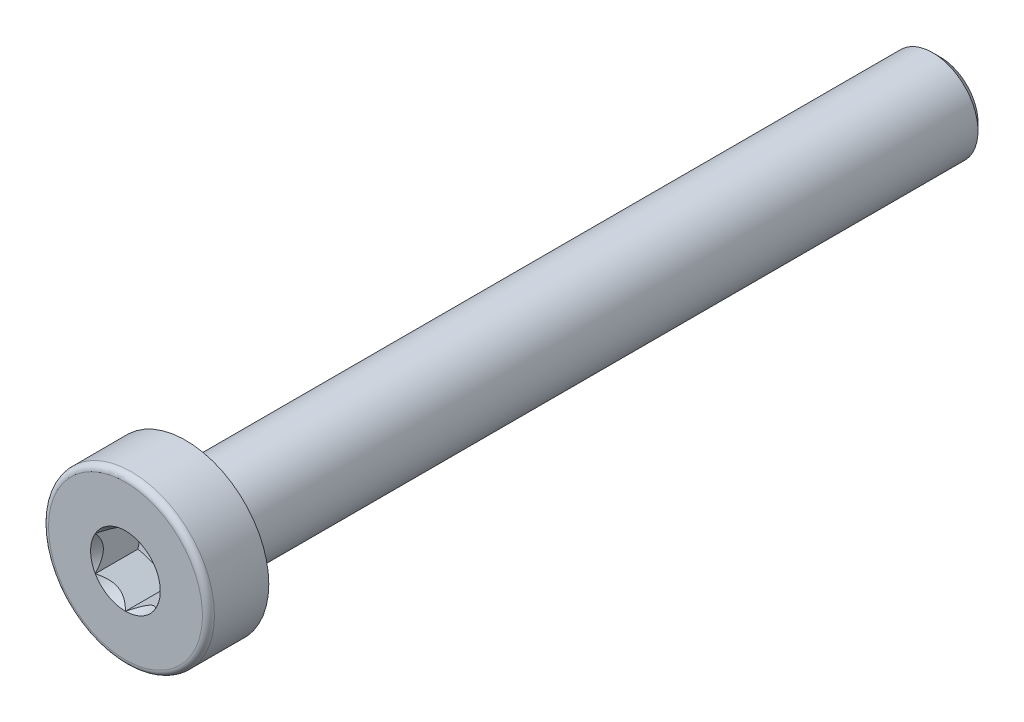
ISO-10303-21;
HEADER;
FILE_DESCRIPTION(('STEP AP214'),'2;1');
FILE_NAME('part.step','',(''),(''),'','','');
FILE_SCHEMA(('AUTOMOTIVE_DESIGN { 1 0 10303 214 1 1 1 1 }'));
ENDSEC;
DATA;
#1=APPLICATION_CONTEXT('core data for automotive mechanical design processes');
#2=APPLICATION_PROTOCOL_DEFINITION('international standard','automotive_design',2000,#1);
#3=PRODUCT_CONTEXT('',#1,'mechanical');
#4=PRODUCT('Part','Part','',(#3));
#5=PRODUCT_RELATED_PRODUCT_CATEGORY('part','',(#4));
#6=PRODUCT_DEFINITION_FORMATION('','',#4);
#7=PRODUCT_DEFINITION_CONTEXT('part definition',#1,'design');
#8=PRODUCT_DEFINITION('design','',#6,#7);
#9=PRODUCT_DEFINITION_SHAPE('','',#8);
#10=(LENGTH_UNIT() NAMED_UNIT(*) SI_UNIT(.MILLI.,.METRE.));
#11=(NAMED_UNIT(*) PLANE_ANGLE_UNIT() SI_UNIT($,.RADIAN.));
#12=(NAMED_UNIT(*) SI_UNIT($,.STERADIAN.) SOLID_ANGLE_UNIT());
#13=UNCERTAINTY_MEASURE_WITH_UNIT(LENGTH_MEASURE(1.E-05),#10,'distance_accuracy_value','');
#14=(GEOMETRIC_REPRESENTATION_CONTEXT(3) GLOBAL_UNCERTAINTY_ASSIGNED_CONTEXT((#13)) GLOBAL_UNIT_ASSIGNED_CONTEXT((#10,
#11,#12)) REPRESENTATION_CONTEXT('',''));
#15=CARTESIAN_POINT('',(0.,0.,0.));
#16=DIRECTION('',(0.,0.,1.));
#17=DIRECTION('',(1.,0.,0.));
#18=AXIS2_PLACEMENT_3D('',#15,#16,#17);
#19=CARTESIAN_POINT('',(0.,0.,13.7823850851816));
#20=DIRECTION('',(0.,0.,1.));
#21=DIRECTION('',(1.,0.,0.));
#22=AXIS2_PLACEMENT_3D('',#19,#20,#21);
#23=CYLINDRICAL_SURFACE('',#22,1.49999999999999);
#24=CARTESIAN_POINT('',(0.,0.,-24.75));
#25=DIRECTION('',(0.,0.,1.));
#26=DIRECTION('',(1.,0.,0.));
#27=AXIS2_PLACEMENT_3D('',#24,#25,#26);
#28=CIRCLE('',#27,1.49999999999999);
#29=CARTESIAN_POINT('',(1.49999999999999,0.,-24.75));
#30=VERTEX_POINT('',#29);
#31=EDGE_CURVE('E116',#30,#30,#28,.T.);
#32=ORIENTED_EDGE('',*,*,#31,.T.);
#33=EDGE_LOOP('',(#32));
#34=FACE_BOUND('',#33,.T.);
#35=CARTESIAN_POINT('',(0.,0.,0.));
#36=DIRECTION('',(0.,0.,1.));
#37=DIRECTION('',(1.,0.,0.));
#38=AXIS2_PLACEMENT_3D('',#35,#36,#37);
#39=CIRCLE('',#38,1.49999999999999);
#40=CARTESIAN_POINT('',(1.49999999999999,0.,0.));
#41=VERTEX_POINT('',#40);
#42=EDGE_CURVE('E306',#41,#41,#39,.T.);
#43=ORIENTED_EDGE('',*,*,#42,.F.);
#44=EDGE_LOOP('',(#43));
#45=FACE_BOUND('',#44,.T.);
#46=ADVANCED_FACE('F35',(#34,#45),#23,.T.);
#47=CARTESIAN_POINT('',(0.,0.,-25.));
#48=DIRECTION('',(0.,0.,1.));
#49=DIRECTION('',(1.,0.,0.));
#50=AXIS2_PLACEMENT_3D('',#47,#48,#49);
#51=PLANE('',#50);
#52=CARTESIAN_POINT('',(0.,0.,-25.));
#53=DIRECTION('',(0.,0.,1.));
#54=DIRECTION('',(1.,0.,0.));
#55=AXIS2_PLACEMENT_3D('',#52,#53,#54);
#56=CIRCLE('',#55,1.24999999999999);
#57=CARTESIAN_POINT('',(1.24999999999999,0.,-25.));
#58=VERTEX_POINT('',#57);
#59=EDGE_CURVE('E280',#58,#58,#56,.F.);
#60=ORIENTED_EDGE('',*,*,#59,.T.);
#61=EDGE_LOOP('',(#60));
#62=FACE_BOUND('',#61,.T.);
#63=ADVANCED_FACE('F257',(#62),#51,.F.);
#64=CARTESIAN_POINT('',(0.,2.75,2.));
#65=DIRECTION('',(0.,0.,-1.));
#66=DIRECTION('',(-1.,0.,0.));
#67=AXIS2_PLACEMENT_3D('',#64,#65,#66);
#68=PLANE('',#67);
#69=CARTESIAN_POINT('',(0.,0.,2.));
#70=DIRECTION('',(0.,0.,-1.));
#71=DIRECTION('',(-1.,0.,0.));
#72=AXIS2_PLACEMENT_3D('',#69,#70,#71);
#73=CIRCLE('',#72,2.55);
#74=CARTESIAN_POINT('',(-2.55,0.,2.));
#75=VERTEX_POINT('',#74);
#76=EDGE_CURVE('E44',#75,#75,#73,.F.);
#77=ORIENTED_EDGE('',*,*,#76,.T.);
#78=EDGE_LOOP('',(#77));
#79=FACE_BOUND('',#78,.T.);
#80=CARTESIAN_POINT('',(0.,0.,2.));
#81=DIRECTION('',(0.,0.,-1.));
#82=DIRECTION('',(-1.,0.,0.));
#83=AXIS2_PLACEMENT_3D('',#80,#81,#82);
#84=CIRCLE('',#83,1.15470053837925);
#85=CARTESIAN_POINT('',(-0.999999999999999,-0.577350269189627,2.));
#86=VERTEX_POINT('',#85);
#87=CARTESIAN_POINT('',(-1.,0.577350269189625,2.));
#88=VERTEX_POINT('',#87);
#89=EDGE_CURVE('E145',#86,#88,#84,.T.);
#90=ORIENTED_EDGE('',*,*,#89,.T.);
#91=CARTESIAN_POINT('',(0.,1.15470053837925,2.));
#92=VERTEX_POINT('',#91);
#93=EDGE_CURVE('E139',#88,#92,#84,.T.);
#94=ORIENTED_EDGE('',*,*,#93,.T.);
#95=CARTESIAN_POINT('',(0.999999999999999,0.577350269189626,2.));
#96=VERTEX_POINT('',#95);
#97=EDGE_CURVE('E104',#92,#96,#84,.T.);
#98=ORIENTED_EDGE('',*,*,#97,.T.);
#99=CARTESIAN_POINT('',(1.,-0.577350269189624,2.));
#100=VERTEX_POINT('',#99);
#101=EDGE_CURVE('E94',#96,#100,#84,.T.);
#102=ORIENTED_EDGE('',*,*,#101,.T.);
#103=CARTESIAN_POINT('',(0.,-1.15470053837925,2.));
#104=VERTEX_POINT('',#103);
#105=EDGE_CURVE('E105',#100,#104,#84,.T.);
#106=ORIENTED_EDGE('',*,*,#105,.T.);
#107=EDGE_CURVE('E149',#104,#86,#84,.T.);
#108=ORIENTED_EDGE('',*,*,#107,.T.);
#109=EDGE_LOOP('',(#90,#94,#98,#102,#106,#108));
#110=FACE_BOUND('',#109,.T.);
#111=ADVANCED_FACE('F138',(#79,#110),#68,.F.);
#112=CARTESIAN_POINT('',(0.,0.,13.7823850851816));
#113=DIRECTION('',(0.,0.,1.));
#114=DIRECTION('',(1.,0.,0.));
#115=AXIS2_PLACEMENT_3D('',#112,#113,#114);
#116=CYLINDRICAL_SURFACE('',#115,2.75);
#117=CARTESIAN_POINT('',(0.,0.,1.8));
#118=DIRECTION('',(0.,0.,-1.));
#119=DIRECTION('',(-1.,0.,0.));
#120=AXIS2_PLACEMENT_3D('',#117,#118,#119);
#121=CIRCLE('',#120,2.75);
#122=CARTESIAN_POINT('',(-2.75,0.,1.8));
#123=VERTEX_POINT('',#122);
#124=EDGE_CURVE('E11',#123,#123,#121,.T.);
#125=ORIENTED_EDGE('',*,*,#124,.T.);
#126=EDGE_LOOP('',(#125));
#127=FACE_BOUND('',#126,.T.);
#128=CARTESIAN_POINT('',(0.,0.,0.));
#129=DIRECTION('',(0.,0.,1.));
#130=DIRECTION('',(1.,0.,0.));
#131=AXIS2_PLACEMENT_3D('',#128,#129,#130);
#132=CIRCLE('',#131,2.75);
#133=CARTESIAN_POINT('',(2.75,0.,0.));
#134=VERTEX_POINT('',#133);
#135=EDGE_CURVE('E117',#134,#134,#132,.T.);
#136=ORIENTED_EDGE('',*,*,#135,.T.);
#137=EDGE_LOOP('',(#136));
#138=FACE_BOUND('',#137,.T.);
#139=ADVANCED_FACE('F293',(#127,#138),#116,.T.);
#140=CARTESIAN_POINT('',(0.,1.49999999999999,0.));
#141=DIRECTION('',(0.,0.,1.));
#142=DIRECTION('',(1.,0.,0.));
#143=AXIS2_PLACEMENT_3D('',#140,#141,#142);
#144=PLANE('',#143);
#145=ORIENTED_EDGE('',*,*,#135,.F.);
#146=EDGE_LOOP('',(#145));
#147=FACE_BOUND('',#146,.T.);
#148=ORIENTED_EDGE('',*,*,#42,.T.);
#149=EDGE_LOOP('',(#148));
#150=FACE_BOUND('',#149,.T.);
#151=ADVANCED_FACE('F176',(#147,#150),#144,.F.);
#152=CARTESIAN_POINT('',(0.,0.,1.5));
#153=DIRECTION('',(0.,0.,1.));
#154=DIRECTION('',(1.,0.,0.));
#155=AXIS2_PLACEMENT_3D('',#152,#153,#154);
#156=CONICAL_SURFACE('',#155,0.866025403784443,0.523598775598292);
#157=CARTESIAN_POINT('',(1.0002,0.577234799135788,2.000200029997));
#158=CARTESIAN_POINT('',(0.979279268361541,0.589313389178896,1.97929811550784));
#159=CARTESIAN_POINT('',(0.957940225065529,0.601633491570097,1.95891371853468));
#160=CARTESIAN_POINT('',(0.914155960739907,0.626912348364765,1.91951466171192));
#161=CARTESIAN_POINT('',(0.891705462153141,0.639874149767276,1.90050785972396));
#162=CARTESIAN_POINT('',(0.8450526943113,0.666809137839203,1.86396414421267));
#163=CARTESIAN_POINT('',(0.820820146898437,0.68079980561117,1.84647791486391));
#164=CARTESIAN_POINT('',(0.77105448827657,0.709532022012904,1.81429554416518));
#165=CARTESIAN_POINT('',(0.745524412641826,0.724271818053055,1.79959323936733));
#166=CARTESIAN_POINT('',(0.690770544239956,0.755883978714048,1.77271617909165));
#167=CARTESIAN_POINT('',(0.661419251549601,0.772829955449888,1.7608766877498));
#168=CARTESIAN_POINT('',(0.601637357438971,0.807345048107326,1.74294902478033));
#169=CARTESIAN_POINT('',(0.571217623045824,0.824907889947886,1.73681433498687));
#170=CARTESIAN_POINT('',(0.509619767029779,0.860471428700254,1.7310580155241));
#171=CARTESIAN_POINT('',(0.478437283434353,0.878474643998074,1.73149551557732));
#172=CARTESIAN_POINT('',(0.416618790859381,0.914165567327131,1.73895874735314));
#173=CARTESIAN_POINT('',(0.385984425481643,0.931852326424421,1.74600171672638));
#174=CARTESIAN_POINT('',(0.31748283126199,0.971401740287056,1.76845838305713));
#175=CARTESIAN_POINT('',(0.280078816307673,0.992996958389704,1.78570088545517));
#176=CARTESIAN_POINT('',(0.20791384151434,1.0346614260127,1.82658449183234));
#177=CARTESIAN_POINT('',(0.173166286976131,1.05472293597901,1.85025561440097));
#178=CARTESIAN_POINT('',(0.115011666338035,1.08829852185904,1.8949401157705));
#179=CARTESIAN_POINT('',(0.0910371098374251,1.10214023850837,1.91499886001135));
#180=CARTESIAN_POINT('',(0.0444955933727116,1.12901099556776,1.95659176351623));
#181=CARTESIAN_POINT('',(0.021915741862136,1.14204747891566,1.97810658432951));
#182=CARTESIAN_POINT('',(-0.000200000000000811,1.15481600843309,2.000200029997));
#183=B_SPLINE_CURVE_WITH_KNOTS('',3,(#157,#158,#159,#160,#161,#162,#163,#164,#165,#166,#167,
#168,#169,#170,#171,#172,#173,#174,#175,#176,#177,#178,#179,#180,#181,#182),.UNSPECIFIED.,.F.,
.F.,(4,2,2,2,2,2,2,2,2,2,2,2,4),(0.,0.0958659016528368,0.192241443295889,0.291107773369439,
0.38975259219868,0.497058572667989,0.603481681231613,0.710862843147697,0.818525009248915,
0.957249028162129,1.09663230358435,1.19912652497417,1.30045698719897),.UNSPECIFIED.);
#184=EDGE_CURVE('E109',#96,#92,#183,.T.);
#185=ORIENTED_EDGE('',*,*,#184,.F.);
#186=ORIENTED_EDGE('',*,*,#97,.F.);
#187=EDGE_LOOP('',(#185,#186));
#188=FACE_BOUND('',#187,.T.);
#189=ADVANCED_FACE('F110',(#188),#156,.F.);
#190=CARTESIAN_POINT('',(1.,-1.02165735250157,2.47615654548771));
#191=CARTESIAN_POINT('',(1.,-1.00044397575286,2.44990281639742));
#192=CARTESIAN_POINT('',(1.,-0.979038473193748,2.42380282853031));
#193=CARTESIAN_POINT('',(1.,-0.93576986130581,2.37197373709653));
#194=CARTESIAN_POINT('',(1.,-0.913906633678318,2.34624473238551));
#195=CARTESIAN_POINT('',(1.,-0.847127573151166,2.26925779287598));
#196=CARTESIAN_POINT('',(1.,-0.801412510827464,2.21868867580903));
#197=CARTESIAN_POINT('',(1.,-0.703938971445222,2.11700322431629));
#198=CARTESIAN_POINT('',(1.,-0.651980765440441,2.06607296341998));
#199=CARTESIAN_POINT('',(1.,-0.570576852760114,1.99376021789749));
#200=CARTESIAN_POINT('',(1.,-0.54291775144091,1.97037516056991));
#201=CARTESIAN_POINT('',(1.,-0.486180005977539,1.92540802009453));
#202=CARTESIAN_POINT('',(1.,-0.457102309340075,1.90382475892277));
#203=CARTESIAN_POINT('',(1.,-0.407754408540972,1.87025086293445));
#204=CARTESIAN_POINT('',(1.,-0.387970490005994,1.85755005236917));
#205=CARTESIAN_POINT('',(1.,-0.347633539957277,1.83343082797955));
#206=CARTESIAN_POINT('',(1.,-0.327080254950427,1.82201284187139));
#207=CARTESIAN_POINT('',(1.,-0.264596580783199,1.79034114157583));
#208=CARTESIAN_POINT('',(1.,-0.221421770487529,1.77236971468505));
#209=CARTESIAN_POINT('',(1.,-0.14432891936732,1.74912049718239));
#210=CARTESIAN_POINT('',(1.,-0.111059340432822,1.74172546824715));
#211=CARTESIAN_POINT('',(1.,-0.0437261281253909,1.73273500689954));
#212=CARTESIAN_POINT('',(1.,-0.00966294896907201,1.73113633521318));
#213=CARTESIAN_POINT('',(1.,0.0582001306582679,1.73398524614318));
#214=CARTESIAN_POINT('',(1.,0.0920000191509261,1.73843310224812));
#215=CARTESIAN_POINT('',(1.,0.158423588342139,1.75271798612461));
#216=CARTESIAN_POINT('',(1.,0.191046079372495,1.76256031059816));
#217=CARTESIAN_POINT('',(1.,0.272918875922629,1.79339537328834));
#218=CARTESIAN_POINT('',(1.,0.32096375923788,1.81754562883158));
#219=CARTESIAN_POINT('',(1.,0.390157081149761,1.85882715506161));
#220=CARTESIAN_POINT('',(1.,0.412871358802396,1.87353528281609));
#221=CARTESIAN_POINT('',(1.,0.457370024941449,1.90428951013235));
#222=CARTESIAN_POINT('',(1.,0.479154855796053,1.92033496221057));
#223=CARTESIAN_POINT('',(1.,0.546605348475578,1.97261441011294));
#224=CARTESIAN_POINT('',(1.,0.59078314428858,2.01075557610207));
#225=CARTESIAN_POINT('',(1.,0.676344558970343,2.09007822955612));
#226=CARTESIAN_POINT('',(1.,0.7177246273255,2.13126344643462));
#227=CARTESIAN_POINT('',(1.,0.798583509223025,2.21587021330501));
#228=CARTESIAN_POINT('',(1.,0.838050903489422,2.25930259718772));
#229=CARTESIAN_POINT('',(1.,0.915367517687237,2.34758664282176));
#230=CARTESIAN_POINT('',(1.,0.953216440638264,2.39243856244479));
#231=CARTESIAN_POINT('',(1.,1.02397528029975,2.47868449839828));
#232=CARTESIAN_POINT('',(1.,1.0570035159012,2.51998192165169));
#233=CARTESIAN_POINT('',(1.,1.12223860185221,2.60322885104812));
#234=CARTESIAN_POINT('',(1.,1.15444532808479,2.64517845420215));
#235=CARTESIAN_POINT('',(1.,1.21778865906949,2.72906401731421));
#236=CARTESIAN_POINT('',(1.,1.24893357502113,2.77099371964918));
#237=CARTESIAN_POINT('',(1.,1.31066176733335,2.85524702616951));
#238=CARTESIAN_POINT('',(1.,1.34124519708783,2.89757051786631));
#239=CARTESIAN_POINT('',(1.,1.37160518448238,2.94005141898861));
#240=B_SPLINE_CURVE_WITH_KNOTS('',3,(#190,#191,#192,#193,#194,#195,#196,#197,#198,#199,#200,
#201,#202,#203,#204,#205,#206,#207,#208,#209,#210,#211,#212,#213,#214,#215,#216,#217,#218,#219,
#220,#221,#222,#223,#224,#225,#226,#227,#228,#229,#230,#231,#232,#233,#234,#235,#236,#237,#238,
#239),.UNSPECIFIED.,.F.,.F.,(4,2,2,2,2,2,2,2,2,2,2,2,2,2,2,2,2,2,2,2,2,2,2,2,4),(0.,
0.101259558759938,0.202545619180657,0.406992471811118,0.62499640404548,0.73360498534286,
0.842141992379802,0.912626378795973,0.983134196634923,1.12261176087243,1.2244269502992,
1.32618523188556,1.42794811622176,1.52981109861471,1.69015057363218,1.77131101505083,
1.85243238730929,2.02727567940076,2.20233684925519,2.37833931130333,2.55437393143192,
2.7130028362207,2.87165556702993,3.02834461896608,3.1849902077459),.UNSPECIFIED.);
#241=EDGE_CURVE('E98',#100,#96,#240,.T.);
#242=ORIENTED_EDGE('',*,*,#241,.F.);
#243=ORIENTED_EDGE('',*,*,#101,.F.);
#244=EDGE_LOOP('',(#242,#243));
#245=FACE_BOUND('',#244,.T.);
#246=ADVANCED_FACE('F96',(#245),#156,.F.);
#247=CARTESIAN_POINT('',(-0.000199999999999182,-1.15481600843309,2.000200029997));
#248=CARTESIAN_POINT('',(0.0207207316384602,-1.14273741838998,1.97929811550784));
#249=CARTESIAN_POINT('',(0.0420597749344721,-1.13041731599878,1.95891371853468));
#250=CARTESIAN_POINT('',(0.0858440392600936,-1.10513845920411,1.91951466171192));
#251=CARTESIAN_POINT('',(0.10829453784686,-1.0921766578016,1.90050785972396));
#252=CARTESIAN_POINT('',(0.1549473056887,-1.06524166972967,1.86396414421267));
#253=CARTESIAN_POINT('',(0.179179853101563,-1.05125100195771,1.84647791486391));
#254=CARTESIAN_POINT('',(0.22894551172343,-1.02251878555597,1.81429554416518));
#255=CARTESIAN_POINT('',(0.254475587358175,-1.00777898951582,1.79959323936733));
#256=CARTESIAN_POINT('',(0.309229455760045,-0.976166828854828,1.77271617909165));
#257=CARTESIAN_POINT('',(0.3385807484504,-0.959220852118988,1.7608766877498));
#258=CARTESIAN_POINT('',(0.39836264256103,-0.92470575946155,1.74294902478033));
#259=CARTESIAN_POINT('',(0.428782376954176,-0.90714291762099,1.73681433498687));
#260=CARTESIAN_POINT('',(0.490380232970222,-0.871579378868622,1.7310580155241));
#261=CARTESIAN_POINT('',(0.521562716565647,-0.853576163570802,1.73149551557732));
#262=CARTESIAN_POINT('',(0.58338120914062,-0.817885240241745,1.73895874735314));
#263=CARTESIAN_POINT('',(0.614015574518357,-0.800198481144455,1.74600171672638));
#264=CARTESIAN_POINT('',(0.68251716873801,-0.76064906728182,1.76845838305713));
#265=CARTESIAN_POINT('',(0.719921183692327,-0.739053849179172,1.78570088545517));
#266=CARTESIAN_POINT('',(0.79208615848566,-0.697389381556179,1.82658449183234));
#267=CARTESIAN_POINT('',(0.826833713023869,-0.677327871589862,1.85025561440098));
#268=CARTESIAN_POINT('',(0.884988333661965,-0.643752285709837,1.8949401157705));
#269=CARTESIAN_POINT('',(0.908962890162575,-0.629910569060508,1.91499886001135));
#270=CARTESIAN_POINT('',(0.955504406627289,-0.603039812001112,1.95659176351624));
#271=CARTESIAN_POINT('',(0.978084258137864,-0.59000332865322,1.97810658432952));
#272=CARTESIAN_POINT('',(1.0002,-0.577234799135787,2.000200029997));
#273=B_SPLINE_CURVE_WITH_KNOTS('',3,(#247,#248,#249,#250,#251,#252,#253,#254,#255,#256,#257,
#258,#259,#260,#261,#262,#263,#264,#265,#266,#267,#268,#269,#270,#271,#272),.UNSPECIFIED.,.F.,
.F.,(4,2,2,2,2,2,2,2,2,2,2,2,4),(0.,0.0958659016528368,0.192241443295889,0.291107773369439,
0.38975259219868,0.497058572667988,0.603481681231612,0.710862843147696,0.818525009248914,
0.957249028162128,1.09663230358435,1.19912652497417,1.30045698719897),.UNSPECIFIED.);
#274=EDGE_CURVE('E128',#104,#100,#273,.T.);
#275=ORIENTED_EDGE('',*,*,#274,.F.);
#276=ORIENTED_EDGE('',*,*,#105,.F.);
#277=EDGE_LOOP('',(#275,#276));
#278=FACE_BOUND('',#277,.T.);
#279=ADVANCED_FACE('F331',(#278),#156,.F.);
#280=CARTESIAN_POINT('',(-1.0002,-0.577234799135788,2.000200029997));
#281=CARTESIAN_POINT('',(-0.979279268361541,-0.589313389178896,1.97929811550784));
#282=CARTESIAN_POINT('',(-0.957940225065529,-0.601633491570098,1.95891371853468));
#283=CARTESIAN_POINT('',(-0.914155960739908,-0.626912348364765,1.91951466171192));
#284=CARTESIAN_POINT('',(-0.891705462153142,-0.639874149767276,1.90050785972396));
#285=CARTESIAN_POINT('',(-0.845052694311302,-0.666809137839203,1.86396414421268));
#286=CARTESIAN_POINT('',(-0.820820146898438,-0.68079980561117,1.84647791486391));
#287=CARTESIAN_POINT('',(-0.771054488276571,-0.709532022012904,1.81429554416518));
#288=CARTESIAN_POINT('',(-0.745524412641826,-0.724271818053055,1.79959323936733));
#289=CARTESIAN_POINT('',(-0.690770544239957,-0.755883978714048,1.77271617909165));
#290=CARTESIAN_POINT('',(-0.661419251549601,-0.772829955449888,1.7608766877498));
#291=CARTESIAN_POINT('',(-0.601637357438972,-0.807345048107326,1.74294902478033));
#292=CARTESIAN_POINT('',(-0.571217623045825,-0.824907889947886,1.73681433498687));
#293=CARTESIAN_POINT('',(-0.50961976702978,-0.860471428700254,1.7310580155241));
#294=CARTESIAN_POINT('',(-0.478437283434354,-0.878474643998074,1.73149551557732));
#295=CARTESIAN_POINT('',(-0.416618790859381,-0.914165567327131,1.73895874735314));
#296=CARTESIAN_POINT('',(-0.385984425481644,-0.931852326424421,1.74600171672638));
#297=CARTESIAN_POINT('',(-0.317482831261991,-0.971401740287056,1.76845838305713));
#298=CARTESIAN_POINT('',(-0.280078816307674,-0.992996958389704,1.78570088545517));
#299=CARTESIAN_POINT('',(-0.207913841514341,-1.0346614260127,1.82658449183234));
#300=CARTESIAN_POINT('',(-0.173166286976132,-1.05472293597901,1.85025561440097));
#301=CARTESIAN_POINT('',(-0.115011666338036,-1.08829852185904,1.8949401157705));
#302=CARTESIAN_POINT('',(-0.0910371098374255,-1.10214023850837,1.91499886001135));
#303=CARTESIAN_POINT('',(-0.0444955933727116,-1.12901099556776,1.95659176351624));
#304=CARTESIAN_POINT('',(-0.0219157418621357,-1.14204747891566,1.97810658432951));
#305=CARTESIAN_POINT('',(0.00020000000000145,-1.15481600843309,2.000200029997));
#306=B_SPLINE_CURVE_WITH_KNOTS('',3,(#280,#281,#282,#283,#284,#285,#286,#287,#288,#289,#290,
#291,#292,#293,#294,#295,#296,#297,#298,#299,#300,#301,#302,#303,#304,#305),.UNSPECIFIED.,.F.,
.F.,(4,2,2,2,2,2,2,2,2,2,2,2,4),(0.,0.0958659016528371,0.192241443295889,0.291107773369439,
0.38975259219868,0.497058572667989,0.603481681231613,0.710862843147697,0.818525009248915,
0.957249028162129,1.09663230358435,1.19912652497417,1.30045698719897),.UNSPECIFIED.);
#307=EDGE_CURVE('E217',#86,#104,#306,.T.);
#308=ORIENTED_EDGE('',*,*,#307,.F.);
#309=ORIENTED_EDGE('',*,*,#107,.F.);
#310=EDGE_LOOP('',(#308,#309));
#311=FACE_BOUND('',#310,.T.);
#312=ADVANCED_FACE('F336',(#311),#156,.F.);
#313=CARTESIAN_POINT('',(-1.,-1.02165616319402,2.4761550733702));
#314=CARTESIAN_POINT('',(-1.,-1.0004428213342,2.44990140240462));
#315=CARTESIAN_POINT('',(-1.,-0.979037353922434,2.42380147254871));
#316=CARTESIAN_POINT('',(-1.,-0.935768813050301,2.37197249679546));
#317=CARTESIAN_POINT('',(-1.,-0.913905621291603,2.34624354975355));
#318=CARTESIAN_POINT('',(-1.,-0.847126671549094,2.26925678490128));
#319=CARTESIAN_POINT('',(-1.,-0.801411685569207,2.21868778399818));
#320=CARTESIAN_POINT('',(-1.,-0.703938315790429,2.11700257362899));
#321=CARTESIAN_POINT('',(-1.,-0.651980203829182,2.06607243708998));
#322=CARTESIAN_POINT('',(-1.,-0.570576442949775,1.993759867361));
#323=CARTESIAN_POINT('',(-1.,-0.542917393743062,1.97037486662205));
#324=CARTESIAN_POINT('',(-1.,-0.486179757564851,1.92540783371777));
#325=CARTESIAN_POINT('',(-1.,-0.457102118092175,1.90382462353767));
#326=CARTESIAN_POINT('',(-1.,-0.407754270075407,1.87025077213631));
#327=CARTESIAN_POINT('',(-1.,-0.387970343521384,1.85754996031903));
#328=CARTESIAN_POINT('',(-1.,-0.347633376849955,1.83343073492685));
#329=CARTESIAN_POINT('',(-1.,-0.327080083239611,1.82201274906801));
#330=CARTESIAN_POINT('',(-1.,-0.264596383052066,1.7903410527134));
#331=CARTESIAN_POINT('',(-1.,-0.221421554407135,1.77236963225318));
#332=CARTESIAN_POINT('',(-1.,-0.144328683876482,1.74912043873988));
#333=CARTESIAN_POINT('',(-1.,-0.111059104339862,1.7417254230843));
#334=CARTESIAN_POINT('',(-1.,-0.0437258929879734,1.73273498908328));
#335=CARTESIAN_POINT('',(-1.,-0.00966271538435313,1.73113633148959));
#336=CARTESIAN_POINT('',(-1.,0.0582003579902662,1.73398526923557));
#337=CARTESIAN_POINT('',(-1.,0.0920002417881432,1.73843313794157));
#338=CARTESIAN_POINT('',(-1.,0.158423800257268,1.75271804394381));
#339=CARTESIAN_POINT('',(-1.,0.191046285258694,1.76256037794039));
#340=CARTESIAN_POINT('',(-1.,0.272919098543878,1.79339547325253));
#341=CARTESIAN_POINT('',(-1.,0.320964001891445,1.81754575639687));
#342=CARTESIAN_POINT('',(-1.,0.390157351430251,1.85882732502053));
#343=CARTESIAN_POINT('',(-1.,0.412871637956133,1.87353546717966));
#344=CARTESIAN_POINT('',(-1.,0.457370321230807,1.90428972343771));
#345=CARTESIAN_POINT('',(-1.,0.479155160348433,1.92033519005245));
#346=CARTESIAN_POINT('',(-1.,0.546605722322868,1.97261471774401));
#347=CARTESIAN_POINT('',(-1.,0.590783574855081,2.01075595354982));
#348=CARTESIAN_POINT('',(-1.,0.676345097748254,2.09007875066971));
#349=CARTESIAN_POINT('',(-1.,0.717725217584276,2.13126404140708));
#350=CARTESIAN_POINT('',(-1.,0.798584199646558,2.21587095846354));
#351=CARTESIAN_POINT('',(-1.,0.838051642573659,2.25930341868967));
#352=CARTESIAN_POINT('',(-1.,0.915368352130489,2.34758761801122));
#353=CARTESIAN_POINT('',(-1.,0.953217321779458,2.39243961497853));
#354=CARTESIAN_POINT('',(-1.,1.02397624498597,2.47868569352402));
#355=CARTESIAN_POINT('',(-1.,1.05700451767433,2.51998318187484));
#356=CARTESIAN_POINT('',(-1.,1.12223967731809,2.60323024158906));
#357=CARTESIAN_POINT('',(-1.,1.15444644015627,2.64517990996363));
#358=CARTESIAN_POINT('',(-1.,1.21778984347131,2.72906560259885));
#359=CARTESIAN_POINT('',(-1.,1.24893479515394,2.77099536923427));
#360=CARTESIAN_POINT('',(-1.,1.310663058712,2.85524880433725));
#361=CARTESIAN_POINT('',(-1.,1.34124652398139,2.89757236031626));
#362=CARTESIAN_POINT('',(-1.,1.37160654683813,2.94005332570477));
#363=B_SPLINE_CURVE_WITH_KNOTS('',3,(#313,#314,#315,#316,#317,#318,#319,#320,#321,#322,#323,
#324,#325,#326,#327,#328,#329,#330,#331,#332,#333,#334,#335,#336,#337,#338,#339,#340,#341,#342,
#343,#344,#345,#346,#347,#348,#349,#350,#351,#352,#353,#354,#355,#356,#357,#358,#359,#360,#361,
#362),.UNSPECIFIED.,.F.,.F.,(4,2,2,2,2,2,2,2,2,2,2,2,2,2,2,2,2,2,2,2,2,2,2,2,4),(0.,
0.101259357336974,0.202545216247672,0.406991656786892,0.624995127202732,0.733603479693652,
0.84214025841231,0.912624667009679,0.983132507003107,1.12261011303114,1.22442529537217,
1.32618357033702,1.42794644599489,1.52980941972694,1.69014898503018,1.77130947231886,
1.85243089039341,2.02727444757215,2.20233588312917,2.37833861280536,2.55437350061162,
2.71300262741254,2.87165558029983,3.02834485101359,3.18499065850899),.UNSPECIFIED.);
#364=EDGE_CURVE('E224',#88,#86,#363,.F.);
#365=ORIENTED_EDGE('',*,*,#364,.F.);
#366=ORIENTED_EDGE('',*,*,#89,.F.);
#367=EDGE_LOOP('',(#365,#366));
#368=FACE_BOUND('',#367,.T.);
#369=ADVANCED_FACE('F233',(#368),#156,.F.);
#370=CARTESIAN_POINT('',(0.000199999999999615,1.15481600843309,2.000200029997));
#371=CARTESIAN_POINT('',(-0.0207207316384596,1.14273741838998,1.97929811550783));
#372=CARTESIAN_POINT('',(-0.0420597749344715,1.13041731599878,1.95891371853468));
#373=CARTESIAN_POINT('',(-0.0858440392600932,1.10513845920411,1.91951466171192));
#374=CARTESIAN_POINT('',(-0.108294537846859,1.0921766578016,1.90050785972396));
#375=CARTESIAN_POINT('',(-0.1549473056887,1.06524166972967,1.86396414421267));
#376=CARTESIAN_POINT('',(-0.179179853101563,1.05125100195771,1.84647791486391));
#377=CARTESIAN_POINT('',(-0.22894551172343,1.02251878555597,1.81429554416518));
#378=CARTESIAN_POINT('',(-0.254475587358175,1.00777898951582,1.79959323936733));
#379=CARTESIAN_POINT('',(-0.309229455760045,0.976166828854828,1.77271617909165));
#380=CARTESIAN_POINT('',(-0.3385807484504,0.959220852118988,1.7608766877498));
#381=CARTESIAN_POINT('',(-0.39836264256103,0.92470575946155,1.74294902478033));
#382=CARTESIAN_POINT('',(-0.428782376954176,0.90714291762099,1.73681433498687));
#383=CARTESIAN_POINT('',(-0.490380232970222,0.871579378868622,1.7310580155241));
#384=CARTESIAN_POINT('',(-0.521562716565647,0.853576163570802,1.73149551557732));
#385=CARTESIAN_POINT('',(-0.58338120914062,0.817885240241745,1.73895874735314));
#386=CARTESIAN_POINT('',(-0.614015574518357,0.800198481144455,1.74600171672638));
#387=CARTESIAN_POINT('',(-0.68251716873801,0.76064906728182,1.76845838305713));
#388=CARTESIAN_POINT('',(-0.719921183692327,0.739053849179172,1.78570088545517));
#389=CARTESIAN_POINT('',(-0.792086158485661,0.697389381556179,1.82658449183234));
#390=CARTESIAN_POINT('',(-0.82683371302387,0.677327871589863,1.85025561440098));
#391=CARTESIAN_POINT('',(-0.884988333661965,0.643752285709838,1.8949401157705));
#392=CARTESIAN_POINT('',(-0.908962890162575,0.629910569060508,1.91499886001135));
#393=CARTESIAN_POINT('',(-0.955504406627289,0.603039812001113,1.95659176351624));
#394=CARTESIAN_POINT('',(-0.978084258137864,0.59000332865322,1.97810658432952));
#395=CARTESIAN_POINT('',(-1.0002,0.577234799135787,2.000200029997));
#396=B_SPLINE_CURVE_WITH_KNOTS('',3,(#370,#371,#372,#373,#374,#375,#376,#377,#378,#379,#380,
#381,#382,#383,#384,#385,#386,#387,#388,#389,#390,#391,#392,#393,#394,#395),.UNSPECIFIED.,.F.,
.F.,(4,2,2,2,2,2,2,2,2,2,2,2,4),(0.,0.0958659016528366,0.192241443295889,0.291107773369439,
0.38975259219868,0.497058572667989,0.603481681231612,0.710862843147696,0.818525009248915,
0.957249028162129,1.09663230358435,1.19912652497417,1.30045698719897),.UNSPECIFIED.);
#397=EDGE_CURVE('E50',#92,#88,#396,.T.);
#398=ORIENTED_EDGE('',*,*,#397,.F.);
#399=ORIENTED_EDGE('',*,*,#93,.F.);
#400=EDGE_LOOP('',(#398,#399));
#401=FACE_BOUND('',#400,.T.);
#402=ADVANCED_FACE('F174',(#401),#156,.F.);
#403=CARTESIAN_POINT('',(0.,0.,-0.0773502691896336));
#404=DIRECTION('',(0.,0.,1.));
#405=DIRECTION('',(1.,0.,0.));
#406=AXIS2_PLACEMENT_3D('',#403,#404,#405);
#407=CONICAL_SURFACE('',#406,0.,1.04719755119659);
#408=CARTESIAN_POINT('',(1.,-1.57519983509836,0.999876806917345));
#409=CARTESIAN_POINT('',(1.,-1.53128931272508,0.97847724086248));
#410=CARTESIAN_POINT('',(1.,-1.48728092226425,0.957279426435131));
#411=CARTESIAN_POINT('',(1.,-1.39901539149635,0.915391601968864));
#412=CARTESIAN_POINT('',(1.,-1.35475821529076,0.894701667652939));
#413=CARTESIAN_POINT('',(1.,-1.22110064583388,0.833351758626668));
#414=CARTESIAN_POINT('',(1.,-1.13126118299234,0.793632201372749));
#415=CARTESIAN_POINT('',(1.,-0.946930099862526,0.716887269206861));
#416=CARTESIAN_POINT('',(1.,-0.852382811581655,0.679994131873322));
#417=CARTESIAN_POINT('',(1.,-0.660910240205015,0.613298863358395));
#418=CARTESIAN_POINT('',(1.,-0.563990697212201,0.583481184378832));
#419=CARTESIAN_POINT('',(1.,-0.416701506261801,0.547600790781909));
#420=CARTESIAN_POINT('',(1.,-0.367419456110045,0.537131105875129));
#421=CARTESIAN_POINT('',(1.,-0.268216788403054,0.519783453365878));
#422=CARTESIAN_POINT('',(1.,-0.218296247873174,0.512905056632107));
#423=CARTESIAN_POINT('',(1.,-0.118726034898544,0.50337453772279));
#424=CARTESIAN_POINT('',(1.,-0.0690818810771028,0.500666325324558));
#425=CARTESIAN_POINT('',(1.,0.0302558026995047,0.499551237880234));
#426=CARTESIAN_POINT('',(1.,0.0799493345515945,0.501144535016002));
#427=CARTESIAN_POINT('',(1.,0.197661332367507,0.509878365984909));
#428=CARTESIAN_POINT('',(1.,0.265542524428887,0.51887985803019));
#429=CARTESIAN_POINT('',(1.,0.400134499715306,0.543400269909588));
#430=CARTESIAN_POINT('',(1.,0.466843951364805,0.558926160596997));
#431=CARTESIAN_POINT('',(1.,0.566724374490898,0.586046661376272));
#432=CARTESIAN_POINT('',(1.,0.600396780747564,0.595869846960055));
#433=CARTESIAN_POINT('',(1.,0.667392862593546,0.616578787207084));
#434=CARTESIAN_POINT('',(1.,0.700716730350773,0.62746391800272));
#435=CARTESIAN_POINT('',(1.,0.767056809381714,0.650124986560646));
#436=CARTESIAN_POINT('',(1.,0.800073029232965,0.661900899403048));
#437=CARTESIAN_POINT('',(1.,0.865833014141306,0.686200716566749));
#438=CARTESIAN_POINT('',(1.,0.898576741987393,0.69872472119664));
#439=CARTESIAN_POINT('',(1.,1.00771327771098,0.741659955312257));
#440=CARTESIAN_POINT('',(1.,1.08355740888923,0.7734652739786));
#441=CARTESIAN_POINT('',(1.,1.23425876136573,0.839343905045436));
#442=CARTESIAN_POINT('',(1.,1.30911575037161,0.873417740248574));
#443=CARTESIAN_POINT('',(1.,1.4581379697828,0.943149769433548));
#444=CARTESIAN_POINT('',(1.,1.5323027758096,0.9788088668652));
#445=CARTESIAN_POINT('',(1.,1.68008619399265,1.05124404339283));
#446=CARTESIAN_POINT('',(1.,1.75370478204759,1.08802017141623));
#447=CARTESIAN_POINT('',(1.,1.97429901617001,1.199730377765));
#448=CARTESIAN_POINT('',(0.999999999999999,2.12065941934544,1.27587678826473));
#449=CARTESIAN_POINT('',(0.999999999999999,2.41235099423998,1.429969436884));
#450=CARTESIAN_POINT('',(0.999999999999999,2.55768253149277,1.50791498904944));
#451=CARTESIAN_POINT('',(0.999999999999999,2.82653014221365,1.65349107887076));
#452=CARTESIAN_POINT('',(0.999999999999999,2.95013121379246,1.72096481021602));
#453=CARTESIAN_POINT('',(0.999999999999999,3.19702092835293,1.85651361545871));
#454=CARTESIAN_POINT('',(0.999999999999999,3.32030953428475,1.92458875673403));
#455=CARTESIAN_POINT('',(0.999999999999999,3.56610625549948,2.06086861025616));
#456=CARTESIAN_POINT('',(0.999999999999999,3.68861541825617,2.12907143489238));
#457=CARTESIAN_POINT('',(0.999999999999999,3.93343633735943,2.26579478108846));
#458=CARTESIAN_POINT('',(0.999999999999999,4.05574811643402,2.33431526193792));
#459=CARTESIAN_POINT('',(0.999999999999999,4.17799604154844,2.40294883395599));
#460=B_SPLINE_CURVE_WITH_KNOTS('',3,(#408,#409,#410,#411,#412,#413,#414,#415,#416,#417,#418,
#419,#420,#421,#422,#423,#424,#425,#426,#427,#428,#429,#430,#431,#432,#433,#434,#435,#436,#437,
#438,#439,#440,#441,#442,#443,#444,#445,#446,#447,#448,#449,#450,#451,#452,#453,#454,#455,#456,
#457,#458,#459),.UNSPECIFIED.,.F.,.F.,(4,2,2,2,2,2,2,2,2,2,2,2,2,2,2,2,2,2,2,2,2,2,2,2,2,4),(0.,
0.146540372507829,0.293102462529507,0.587721513499405,0.892067147524242,1.19573767952709,
1.346777174725,1.49779861773267,1.64677046428274,1.79574827400221,2.00075719628768,
2.2059857150945,2.31120015589258,2.41635315370937,2.52150321092757,2.62666739907821,
2.87333057738341,3.12005079982519,3.36691347867643,3.61378698607682,4.10871036161526,
4.60344805808865,5.02590196662373,5.44840381987686,5.86904691804744,6.28963752051796),.UNSPECIFIED.);
#461=CARTESIAN_POINT('',(1.,-0.577350269189625,0.589316397477041));
#462=VERTEX_POINT('',#461);
#463=CARTESIAN_POINT('',(1.,0.577350269189626,0.589316397477041));
#464=VERTEX_POINT('',#463);
#465=EDGE_CURVE('E134',#462,#464,#460,.T.);
#466=ORIENTED_EDGE('',*,*,#465,.T.);
#467=CARTESIAN_POINT('',(1.0002,0.577234799135788,0.589383074142708));
#468=CARTESIAN_POINT('',(0.95625268060172,0.602607795820547,0.574725371126188));
#469=CARTESIAN_POINT('',(0.911926016050179,0.628199807531657,0.561394121097935));
#470=CARTESIAN_POINT('',(0.822504925328878,0.679827098330831,0.538122905100495));
#471=CARTESIAN_POINT('',(0.777408908798268,0.705863295614158,0.528191174026822));
#472=CARTESIAN_POINT('',(0.68777582947738,0.757612978088367,0.512729092359119));
#473=CARTESIAN_POINT('',(0.64325256776678,0.783318495222183,0.507095865575993));
#474=CARTESIAN_POINT('',(0.553996260284982,0.834850648373671,0.500367686117293));
#475=CARTESIAN_POINT('',(0.509263539518504,0.860677096749781,0.499267165398703));
#476=CARTESIAN_POINT('',(0.425658889182652,0.908946264126689,0.501541449775177));
#477=CARTESIAN_POINT('',(0.386774523211232,0.931396163287557,0.504357836340449));
#478=CARTESIAN_POINT('',(0.309259155014812,0.976149681982093,0.51328884769439));
#479=CARTESIAN_POINT('',(0.270628421438359,0.99845314641145,0.519406531231339));
#480=CARTESIAN_POINT('',(0.192952883515854,1.04329913914046,0.534702123202863));
#481=CARTESIAN_POINT('',(0.153917923728831,1.0658359836813,0.543944949646));
#482=CARTESIAN_POINT('',(0.0764306187239869,1.11057330008463,0.56492324323257));
#483=CARTESIAN_POINT('',(0.0379772787061398,1.13277434629517,0.576653772610703));
#484=CARTESIAN_POINT('',(-0.000200000000000753,1.15481600843309,0.589383074142707));
#485=B_SPLINE_CURVE_WITH_KNOTS('',3,(#467,#468,#469,#470,#471,#472,#473,#474,#475,#476,#477,
#478,#479,#480,#481,#482,#483,#484),.UNSPECIFIED.,.F.,.F.,(4,2,2,2,2,2,2,2,4),(0.,
0.158523820030116,0.317428970089344,0.472400167924635,0.62718093997165,0.762016584872712,
0.896977373984234,1.03493410168667,1.17261952416172),.UNSPECIFIED.);
#486=CARTESIAN_POINT('',(0.,1.15470053837925,0.589316397477041));
#487=VERTEX_POINT('',#486);
#488=EDGE_CURVE('E132',#464,#487,#485,.T.);
#489=ORIENTED_EDGE('',*,*,#488,.T.);
#490=CARTESIAN_POINT('',(0.000199999999999084,1.15481600843309,0.589383074142707));
#491=CARTESIAN_POINT('',(-0.0437473193982809,1.12944301174833,0.574725371126187));
#492=CARTESIAN_POINT('',(-0.0880739839498214,1.10385100003722,0.561394121097935));
#493=CARTESIAN_POINT('',(-0.177495074671123,1.05222370923805,0.538122905100495));
#494=CARTESIAN_POINT('',(-0.222591091201733,1.02618751195472,0.528191174026822));
#495=CARTESIAN_POINT('',(-0.31222417052262,0.974437829480509,0.512729092359119));
#496=CARTESIAN_POINT('',(-0.356747432233221,0.948732312346694,0.507095865575993));
#497=CARTESIAN_POINT('',(-0.446003739715019,0.897200159195205,0.500367686117293));
#498=CARTESIAN_POINT('',(-0.490736460481496,0.871373710819095,0.499267165398703));
#499=CARTESIAN_POINT('',(-0.574341110817348,0.823104543442187,0.501541449775178));
#500=CARTESIAN_POINT('',(-0.613225476788768,0.800654644281319,0.504357836340449));
#501=CARTESIAN_POINT('',(-0.690740844985188,0.755901125586783,0.51328884769439));
#502=CARTESIAN_POINT('',(-0.729371578561641,0.733597661157426,0.51940653123134));
#503=CARTESIAN_POINT('',(-0.807047116484147,0.688751668428418,0.534702123202863));
#504=CARTESIAN_POINT('',(-0.846082076271169,0.666214823887574,0.543944949646));
#505=CARTESIAN_POINT('',(-0.923569381276014,0.621477507484249,0.564923243232571));
#506=CARTESIAN_POINT('',(-0.962022721293861,0.599276461273705,0.576653772610704));
#507=CARTESIAN_POINT('',(-1.0002,0.577234799135787,0.589383074142708));
#508=B_SPLINE_CURVE_WITH_KNOTS('',3,(#490,#491,#492,#493,#494,#495,#496,#497,#498,#499,#500,
#501,#502,#503,#504,#505,#506,#507),.UNSPECIFIED.,.F.,.F.,(4,2,2,2,2,2,2,2,4),(0.,
0.158523820030116,0.317428970089343,0.472400167924634,0.627180939971649,0.762016584872712,
0.896977373984234,1.03493410168667,1.17261952416172),.UNSPECIFIED.);
#509=CARTESIAN_POINT('',(-1.,0.577350269189625,0.589316397477043));
#510=VERTEX_POINT('',#509);
#511=EDGE_CURVE('E144',#487,#510,#508,.T.);
#512=ORIENTED_EDGE('',*,*,#511,.T.);
#513=CARTESIAN_POINT('',(-1.,-1.57519983407935,0.999876806420657));
#514=CARTESIAN_POINT('',(-1.,-1.53128931174052,0.978477240386551));
#515=CARTESIAN_POINT('',(-1.,-1.48728092131414,0.957279425979944));
#516=CARTESIAN_POINT('',(-1.,-1.39901539061528,0.915391601555058));
#517=CARTESIAN_POINT('',(-1.,-1.35475821444426,0.894701667259771));
#518=CARTESIAN_POINT('',(-1.,-1.22110064509204,0.833351758295534));
#519=CARTESIAN_POINT('',(-1.,-1.13126118232082,0.793632201082731));
#520=CARTESIAN_POINT('',(-1.,-0.94693009933738,0.71688726899907));
#521=CARTESIAN_POINT('',(-1.,-0.85238281113264,0.679994131706477));
#522=CARTESIAN_POINT('',(-1.,-0.660910239911404,0.613298863266534));
#523=CARTESIAN_POINT('',(-1.,-0.563990696997851,0.583481184321032));
#524=CARTESIAN_POINT('',(-1.,-0.416701506189498,0.547600790767053));
#525=CARTESIAN_POINT('',(-1.,-0.367419456098903,0.537131105874443));
#526=CARTESIAN_POINT('',(-1.,-0.268216788515737,0.519783453384321));
#527=CARTESIAN_POINT('',(-1.,-0.218296248048519,0.512905056655517));
#528=CARTESIAN_POINT('',(-1.,-0.118726035198237,0.503374537744955));
#529=CARTESIAN_POINT('',(-1.,-0.0690818814384676,0.500666325340717));
#530=CARTESIAN_POINT('',(-1.,0.0302558022157085,0.499551237873546));
#531=CARTESIAN_POINT('',(-1.,0.0799493340070393,0.501144534992469));
#532=CARTESIAN_POINT('',(-1.,0.197661331730957,0.509878365914543));
#533=CARTESIAN_POINT('',(-1.,0.265542523761645,0.518879857931649));
#534=CARTESIAN_POINT('',(-1.,0.400134498989025,0.543400269754048));
#535=CARTESIAN_POINT('',(-1.,0.466843950610181,0.558926160412625));
#536=CARTESIAN_POINT('',(-1.,0.566724373693674,0.586046661149298));
#537=CARTESIAN_POINT('',(-1.,0.600396779935697,0.59586984671873));
#538=CARTESIAN_POINT('',(-1.,0.667392861752583,0.616578786937508));
#539=CARTESIAN_POINT('',(-1.,0.700716729495356,0.627463917719247));
#540=CARTESIAN_POINT('',(-1.,0.767056808497494,0.650124986249876));
#541=CARTESIAN_POINT('',(-1.,0.800073028334396,0.66190089907888));
#542=CARTESIAN_POINT('',(-1.,0.865833013214034,0.68620071621625));
#543=CARTESIAN_POINT('',(-1.,0.898576741045766,0.698724720833208));
#544=CARTESIAN_POINT('',(-1.,1.00771327668129,0.741659954890576));
#545=CARTESIAN_POINT('',(-1.,1.08355740778645,0.773465273510823));
#546=CARTESIAN_POINT('',(-1.,1.2342587601172,0.839343904485416));
#547=CARTESIAN_POINT('',(-1.,1.30911574905043,0.873417739642406));
#548=CARTESIAN_POINT('',(-1.,1.45813796831649,0.943149768735366));
#549=CARTESIAN_POINT('',(-1.,1.5323027742708,0.978808866121153));
#550=CARTESIAN_POINT('',(-1.,1.68008619230885,1.05124404255742));
#551=CARTESIAN_POINT('',(-1.,1.75370478029128,1.08802017053532));
#552=CARTESIAN_POINT('',(-1.,1.97429901419627,1.19973037674819));
#553=CARTESIAN_POINT('',(-1.,2.12065941722663,1.27587678715807));
#554=CARTESIAN_POINT('',(-1.,2.41235099183056,1.42996943559875));
#555=CARTESIAN_POINT('',(-1.,2.5576825289378,1.50791498767544));
#556=CARTESIAN_POINT('',(-1.,2.82653013939945,1.65349107733888));
#557=CARTESIAN_POINT('',(-1.,2.95013121086458,1.72096480861497));
#558=CARTESIAN_POINT('',(-1.,3.19702092519742,1.85651361371984));
#559=CARTESIAN_POINT('',(-1.,3.3203095310153,1.92458875492652));
#560=CARTESIAN_POINT('',(-1.,3.56610625200136,2.06086860831145));
#561=CARTESIAN_POINT('',(-1.,3.68861541464331,2.12907143287911));
#562=CARTESIAN_POINT('',(-1.,3.93343633351695,2.26579477893834));
#563=CARTESIAN_POINT('',(-1.,4.05574811247665,2.33431525971953));
#564=CARTESIAN_POINT('',(-1.,4.17799603747612,2.40294883166942));
#565=B_SPLINE_CURVE_WITH_KNOTS('',3,(#513,#514,#515,#516,#517,#518,#519,#520,#521,#522,#523,
#524,#525,#526,#527,#528,#529,#530,#531,#532,#533,#534,#535,#536,#537,#538,#539,#540,#541,#542,
#543,#544,#545,#546,#547,#548,#549,#550,#551,#552,#553,#554,#555,#556,#557,#558,#559,#560,#561,
#562,#563,#564),.UNSPECIFIED.,.F.,.F.,(4,2,2,2,2,2,2,2,2,2,2,2,2,2,2,2,2,2,2,2,2,2,2,2,2,4),(0.,
0.146540372387677,0.293102462289184,0.587721513016268,0.892067146783706,1.19573767853015,
1.34677717354015,1.49779861636018,1.64677046272721,1.79574827226353,2.00075719444674,
2.20598571315095,2.31120015389479,2.4163531516574,2.52150320882153,2.62666739691807,
2.87333057496753,3.12005079715357,3.36691347574919,3.61378698289396,4.10871035792188,
4.60344805388464,5.02590196202092,5.44840381487528,5.86904691264507,6.28963751471477),.UNSPECIFIED.);
#566=CARTESIAN_POINT('',(-1.,-0.577350269189671,0.589316397477012));
#567=VERTEX_POINT('',#566);
#568=EDGE_CURVE('E203',#510,#567,#565,.F.);
#569=ORIENTED_EDGE('',*,*,#568,.T.);
#570=CARTESIAN_POINT('',(-1.0002,-0.577234799135788,0.589383074142708));
#571=CARTESIAN_POINT('',(-0.956252680601721,-0.602607795820547,0.574725371126188));
#572=CARTESIAN_POINT('',(-0.91192601605018,-0.628199807531657,0.561394121097936));
#573=CARTESIAN_POINT('',(-0.822504925328878,-0.679827098330831,0.538122905100496));
#574=CARTESIAN_POINT('',(-0.777408908798269,-0.705863295614158,0.528191174026822));
#575=CARTESIAN_POINT('',(-0.687775829477381,-0.757612978088367,0.512729092359119));
#576=CARTESIAN_POINT('',(-0.64325256776678,-0.783318495222183,0.507095865575993));
#577=CARTESIAN_POINT('',(-0.553996260284982,-0.834850648373671,0.500367686117293));
#578=CARTESIAN_POINT('',(-0.509263539518505,-0.860677096749781,0.499267165398703));
#579=CARTESIAN_POINT('',(-0.425658889182652,-0.90894626412669,0.501541449775178));
#580=CARTESIAN_POINT('',(-0.386774523211233,-0.931396163287557,0.504357836340449));
#581=CARTESIAN_POINT('',(-0.309259155014813,-0.976149681982093,0.51328884769439));
#582=CARTESIAN_POINT('',(-0.27062842143836,-0.998453146411451,0.519406531231339));
#583=CARTESIAN_POINT('',(-0.192952883515854,-1.04329913914046,0.534702123202863));
#584=CARTESIAN_POINT('',(-0.153917923728831,-1.0658359836813,0.543944949646));
#585=CARTESIAN_POINT('',(-0.0764306187239869,-1.11057330008463,0.56492324323257));
#586=CARTESIAN_POINT('',(-0.0379772787061397,-1.13277434629517,0.576653772610704));
#587=CARTESIAN_POINT('',(0.000200000000001039,-1.15481600843309,0.589383074142707));
#588=B_SPLINE_CURVE_WITH_KNOTS('',3,(#570,#571,#572,#573,#574,#575,#576,#577,#578,#579,#580,
#581,#582,#583,#584,#585,#586,#587),.UNSPECIFIED.,.F.,.F.,(4,2,2,2,2,2,2,2,4),(0.,
0.158523820030116,0.317428970089344,0.472400167924635,0.62718093997165,0.762016584872713,
0.896977373984235,1.03493410168667,1.17261952416172),.UNSPECIFIED.);
#589=CARTESIAN_POINT('',(0.,-1.15470053837925,0.589316397477041));
#590=VERTEX_POINT('',#589);
#591=EDGE_CURVE('E195',#567,#590,#588,.T.);
#592=ORIENTED_EDGE('',*,*,#591,.T.);
#593=CARTESIAN_POINT('',(-0.000199999999999113,-1.15481600843309,0.589383074142707));
#594=CARTESIAN_POINT('',(0.0437473193982808,-1.12944301174833,0.574725371126187));
#595=CARTESIAN_POINT('',(0.0880739839498213,-1.10385100003722,0.561394121097935));
#596=CARTESIAN_POINT('',(0.177495074671123,-1.05222370923805,0.538122905100495));
#597=CARTESIAN_POINT('',(0.222591091201733,-1.02618751195472,0.528191174026822));
#598=CARTESIAN_POINT('',(0.31222417052262,-0.974437829480509,0.512729092359119));
#599=CARTESIAN_POINT('',(0.356747432233221,-0.948732312346694,0.507095865575993));
#600=CARTESIAN_POINT('',(0.446003739715019,-0.897200159195205,0.500367686117293));
#601=CARTESIAN_POINT('',(0.490736460481496,-0.871373710819095,0.499267165398703));
#602=CARTESIAN_POINT('',(0.574341110817348,-0.823104543442187,0.501541449775177));
#603=CARTESIAN_POINT('',(0.613225476788768,-0.800654644281319,0.504357836340449));
#604=CARTESIAN_POINT('',(0.690740844985188,-0.755901125586783,0.51328884769439));
#605=CARTESIAN_POINT('',(0.72937157856164,-0.733597661157426,0.519406531231339));
#606=CARTESIAN_POINT('',(0.807047116484146,-0.688751668428418,0.534702123202863));
#607=CARTESIAN_POINT('',(0.846082076271168,-0.666214823887575,0.543944949646));
#608=CARTESIAN_POINT('',(0.923569381276013,-0.621477507484249,0.56492324323257));
#609=CARTESIAN_POINT('',(0.96202272129386,-0.599276461273705,0.576653772610704));
#610=CARTESIAN_POINT('',(1.0002,-0.577234799135787,0.589383074142708));
#611=B_SPLINE_CURVE_WITH_KNOTS('',3,(#593,#594,#595,#596,#597,#598,#599,#600,#601,#602,#603,
#604,#605,#606,#607,#608,#609,#610),.UNSPECIFIED.,.F.,.F.,(4,2,2,2,2,2,2,2,4),(0.,
0.158523820030116,0.317428970089343,0.472400167924635,0.62718093997165,0.762016584872712,
0.896977373984233,1.03493410168667,1.17261952416172),.UNSPECIFIED.);
#612=EDGE_CURVE('E189',#590,#462,#611,.T.);
#613=ORIENTED_EDGE('',*,*,#612,.T.);
#614=EDGE_LOOP('',(#466,#489,#512,#569,#592,#613));
#615=FACE_BOUND('',#614,.T.);
#616=CARTESIAN_POINT('',(0.,0.,-0.0773502691896336));
#617=VERTEX_POINT('',#616);
#618=VERTEX_LOOP('',#617);
#619=FACE_BOUND('',#618,.T.);
#620=ADVANCED_FACE('F170',(#615,#619),#407,.F.);
#621=CARTESIAN_POINT('',(1.,0.577350269189626,-25.001));
#622=DIRECTION('',(0.499999999999999,0.866025403784439,0.));
#623=DIRECTION('',(-0.866025403784439,0.499999999999999,0.));
#624=AXIS2_PLACEMENT_3D('',#621,#622,#623);
#625=PLANE('',#624);
#626=DIRECTION('',(0.,0.,1.));
#627=VECTOR('',#626,1.);
#628=CARTESIAN_POINT('',(1.,0.577350269189626,-25.001));
#629=LINE('',#628,#627);
#630=EDGE_CURVE('E124',#464,#96,#629,.T.);
#631=ORIENTED_EDGE('',*,*,#630,.T.);
#632=ORIENTED_EDGE('',*,*,#184,.T.);
#633=DIRECTION('',(0.,0.,1.));
#634=VECTOR('',#633,1.);
#635=CARTESIAN_POINT('',(0.,1.15470053837925,-25.001));
#636=LINE('',#635,#634);
#637=EDGE_CURVE('E309',#487,#92,#636,.T.);
#638=ORIENTED_EDGE('',*,*,#637,.F.);
#639=ORIENTED_EDGE('',*,*,#488,.F.);
#640=EDGE_LOOP('',(#631,#632,#638,#639));
#641=FACE_BOUND('',#640,.T.);
#642=ADVANCED_FACE('F131',(#641),#625,.F.);
#643=CARTESIAN_POINT('',(1.,-0.577350269189625,-25.001));
#644=DIRECTION('',(1.,0.,0.));
#645=DIRECTION('',(0.,1.,0.));
#646=AXIS2_PLACEMENT_3D('',#643,#644,#645);
#647=PLANE('',#646);
#648=DIRECTION('',(0.,0.,1.));
#649=VECTOR('',#648,1.);
#650=CARTESIAN_POINT('',(1.,-0.577350269189625,-25.001));
#651=LINE('',#650,#649);
#652=EDGE_CURVE('E126',#462,#100,#651,.T.);
#653=ORIENTED_EDGE('',*,*,#652,.T.);
#654=ORIENTED_EDGE('',*,*,#241,.T.);
#655=ORIENTED_EDGE('',*,*,#630,.F.);
#656=ORIENTED_EDGE('',*,*,#465,.F.);
#657=EDGE_LOOP('',(#653,#654,#655,#656));
#658=FACE_BOUND('',#657,.T.);
#659=ADVANCED_FACE('F122',(#658),#647,.F.);
#660=CARTESIAN_POINT('',(0.,-1.15470053837925,-25.001));
#661=DIRECTION('',(0.5,-0.866025403784438,0.));
#662=DIRECTION('',(0.866025403784438,0.5,0.));
#663=AXIS2_PLACEMENT_3D('',#660,#661,#662);
#664=PLANE('',#663);
#665=DIRECTION('',(0.,0.,1.));
#666=VECTOR('',#665,1.);
#667=CARTESIAN_POINT('',(0.,-1.15470053837925,-25.001));
#668=LINE('',#667,#666);
#669=EDGE_CURVE('E201',#590,#104,#668,.T.);
#670=ORIENTED_EDGE('',*,*,#669,.T.);
#671=ORIENTED_EDGE('',*,*,#274,.T.);
#672=ORIENTED_EDGE('',*,*,#652,.F.);
#673=ORIENTED_EDGE('',*,*,#612,.F.);
#674=EDGE_LOOP('',(#670,#671,#672,#673));
#675=FACE_BOUND('',#674,.T.);
#676=ADVANCED_FACE('F211',(#675),#664,.F.);
#677=CARTESIAN_POINT('',(-1.,-0.577350269189626,-25.001));
#678=DIRECTION('',(-0.499999999999999,-0.866025403784439,0.));
#679=DIRECTION('',(0.866025403784439,-0.499999999999999,0.));
#680=AXIS2_PLACEMENT_3D('',#677,#678,#679);
#681=PLANE('',#680);
#682=DIRECTION('',(0.,0.,1.));
#683=VECTOR('',#682,1.);
#684=CARTESIAN_POINT('',(-1.,-0.577350269189626,-25.001));
#685=LINE('',#684,#683);
#686=EDGE_CURVE('E202',#567,#86,#685,.T.);
#687=ORIENTED_EDGE('',*,*,#686,.T.);
#688=ORIENTED_EDGE('',*,*,#307,.T.);
#689=ORIENTED_EDGE('',*,*,#669,.F.);
#690=ORIENTED_EDGE('',*,*,#591,.F.);
#691=EDGE_LOOP('',(#687,#688,#689,#690));
#692=FACE_BOUND('',#691,.T.);
#693=ADVANCED_FACE('F207',(#692),#681,.F.);
#694=CARTESIAN_POINT('',(-1.,0.577350269189625,-25.001));
#695=DIRECTION('',(-1.,0.,0.));
#696=DIRECTION('',(0.,-1.,0.));
#697=AXIS2_PLACEMENT_3D('',#694,#695,#696);
#698=PLANE('',#697);
#699=DIRECTION('',(0.,0.,1.));
#700=VECTOR('',#699,1.);
#701=CARTESIAN_POINT('',(-1.,0.577350269189625,-25.001));
#702=LINE('',#701,#700);
#703=EDGE_CURVE('E58',#510,#88,#702,.T.);
#704=ORIENTED_EDGE('',*,*,#703,.T.);
#705=ORIENTED_EDGE('',*,*,#364,.T.);
#706=ORIENTED_EDGE('',*,*,#686,.F.);
#707=ORIENTED_EDGE('',*,*,#568,.F.);
#708=EDGE_LOOP('',(#704,#705,#706,#707));
#709=FACE_BOUND('',#708,.T.);
#710=ADVANCED_FACE('F210',(#709),#698,.F.);
#711=CARTESIAN_POINT('',(0.,1.15470053837925,-25.001));
#712=DIRECTION('',(-0.5,0.866025403784439,0.));
#713=DIRECTION('',(-0.866025403784439,-0.5,0.));
#714=AXIS2_PLACEMENT_3D('',#711,#712,#713);
#715=PLANE('',#714);
#716=ORIENTED_EDGE('',*,*,#637,.T.);
#717=ORIENTED_EDGE('',*,*,#397,.T.);
#718=ORIENTED_EDGE('',*,*,#703,.F.);
#719=ORIENTED_EDGE('',*,*,#511,.F.);
#720=EDGE_LOOP('',(#716,#717,#718,#719));
#721=FACE_BOUND('',#720,.T.);
#722=ADVANCED_FACE('F167',(#721),#715,.F.);
#723=CARTESIAN_POINT('',(0.,0.,-24.75));
#724=DIRECTION('',(0.,0.,1.));
#725=DIRECTION('',(1.,0.,0.));
#726=AXIS2_PLACEMENT_3D('',#723,#724,#725);
#727=CONICAL_SURFACE('',#726,1.49999999999999,0.785398163397452);
#728=ORIENTED_EDGE('',*,*,#59,.F.);
#729=EDGE_LOOP('',(#728));
#730=FACE_BOUND('',#729,.T.);
#731=ORIENTED_EDGE('',*,*,#31,.F.);
#732=EDGE_LOOP('',(#731));
#733=FACE_BOUND('',#732,.T.);
#734=ADVANCED_FACE('F268',(#730,#733),#727,.T.);
#735=CARTESIAN_POINT('',(0.,0.,1.8));
#736=DIRECTION('',(0.,0.,-1.));
#737=DIRECTION('',(-1.,0.,0.));
#738=AXIS2_PLACEMENT_3D('',#735,#736,#737);
#739=TOROIDAL_SURFACE('',#738,2.55,0.2);
#740=ORIENTED_EDGE('',*,*,#124,.F.);
#741=EDGE_LOOP('',(#740));
#742=FACE_BOUND('',#741,.T.);
#743=ORIENTED_EDGE('',*,*,#76,.F.);
#744=EDGE_LOOP('',(#743));
#745=FACE_BOUND('',#744,.T.);
#746=ADVANCED_FACE('F37',(#742,#745),#739,.T.);
#747=CLOSED_SHELL('',(#46,#63,#111,#139,#151,#189,#246,#279,#312,#369,#402,#620,#642,#659,#676,
#693,#710,#722,#734,#746));
#748=MANIFOLD_SOLID_BREP('B2',#747);
#749=ADVANCED_BREP_SHAPE_REPRESENTATION('',(#18,#748),#14);
#750=SHAPE_DEFINITION_REPRESENTATION(#9,#749);
ENDSEC;
END-ISO-10303-21;
